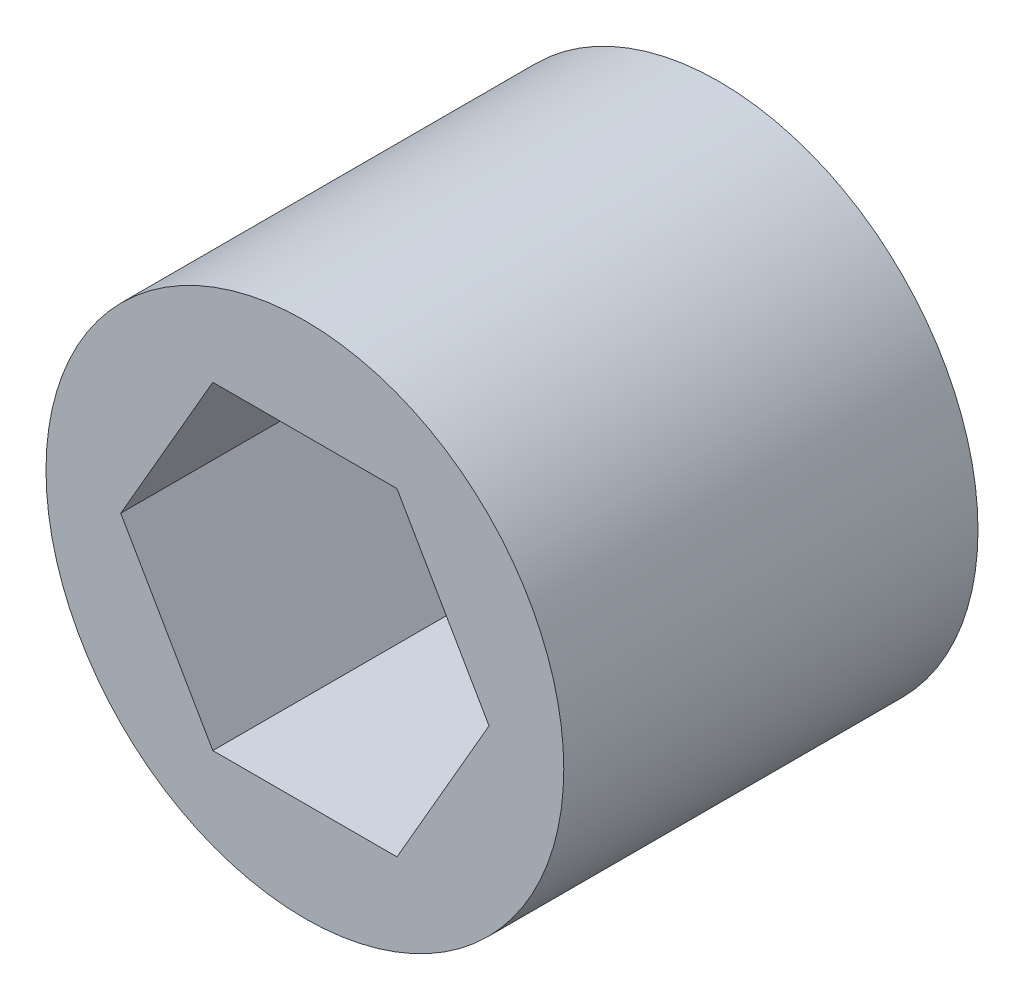
ISO-10303-21;
HEADER;
FILE_DESCRIPTION(('STEP AP214'),'2;1');
FILE_NAME('part.step','',(''),(''),'','','');
FILE_SCHEMA(('AUTOMOTIVE_DESIGN { 1 0 10303 214 1 1 1 1 }'));
ENDSEC;
DATA;
#1=APPLICATION_CONTEXT('core data for automotive mechanical design processes');
#2=APPLICATION_PROTOCOL_DEFINITION('international standard','automotive_design',2000,#1);
#3=PRODUCT_CONTEXT('',#1,'mechanical');
#4=PRODUCT('Part','Part','',(#3));
#5=PRODUCT_RELATED_PRODUCT_CATEGORY('part','',(#4));
#6=PRODUCT_DEFINITION_FORMATION('','',#4);
#7=PRODUCT_DEFINITION_CONTEXT('part definition',#1,'design');
#8=PRODUCT_DEFINITION('design','',#6,#7);
#9=PRODUCT_DEFINITION_SHAPE('','',#8);
#10=(LENGTH_UNIT() NAMED_UNIT(*) SI_UNIT(.MILLI.,.METRE.));
#11=(NAMED_UNIT(*) PLANE_ANGLE_UNIT() SI_UNIT($,.RADIAN.));
#12=(NAMED_UNIT(*) SI_UNIT($,.STERADIAN.) SOLID_ANGLE_UNIT());
#13=UNCERTAINTY_MEASURE_WITH_UNIT(LENGTH_MEASURE(1.E-05),#10,'distance_accuracy_value','');
#14=(GEOMETRIC_REPRESENTATION_CONTEXT(3) GLOBAL_UNCERTAINTY_ASSIGNED_CONTEXT((#13)) GLOBAL_UNIT_ASSIGNED_CONTEXT((#10,
#11,#12)) REPRESENTATION_CONTEXT('',''));
#15=CARTESIAN_POINT('',(0.,0.,0.));
#16=DIRECTION('',(0.,0.,1.));
#17=DIRECTION('',(1.,0.,0.));
#18=AXIS2_PLACEMENT_3D('',#15,#16,#17);
#19=CARTESIAN_POINT('',(0.,0.,6.35));
#20=DIRECTION('',(0.,0.,-1.));
#21=DIRECTION('',(-1.,0.,0.));
#22=AXIS2_PLACEMENT_3D('',#19,#20,#21);
#23=PLANE('',#22);
#24=CARTESIAN_POINT('',(0.,0.,6.35));
#25=DIRECTION('',(0.,0.,1.));
#26=DIRECTION('',(-1.,0.,0.));
#27=AXIS2_PLACEMENT_3D('',#24,#25,#26);
#28=CIRCLE('',#27,7.9375);
#29=CARTESIAN_POINT('',(-7.9375,0.,6.35));
#30=VERTEX_POINT('',#29);
#31=EDGE_CURVE('E11',#30,#30,#28,.T.);
#32=ORIENTED_EDGE('',*,*,#31,.T.);
#33=EDGE_LOOP('',(#32));
#34=FACE_BOUND('',#33,.T.);
#35=DIRECTION('',(-1.,0.,0.));
#36=VECTOR('',#35,1.);
#37=CARTESIAN_POINT('',(2.82295414120268,4.8895,6.35));
#38=LINE('',#37,#36);
#39=CARTESIAN_POINT('',(2.82295414120268,4.8895,6.35));
#40=VERTEX_POINT('',#39);
#41=CARTESIAN_POINT('',(-2.82295414120268,4.8895,6.35));
#42=VERTEX_POINT('',#41);
#43=EDGE_CURVE('E87',#40,#42,#38,.T.);
#44=ORIENTED_EDGE('',*,*,#43,.F.);
#45=DIRECTION('',(-0.5,0.866025403784439,0.));
#46=VECTOR('',#45,1.);
#47=CARTESIAN_POINT('',(5.64590828240535,0.,6.35));
#48=LINE('',#47,#46);
#49=CARTESIAN_POINT('',(5.64590828240535,0.,6.35));
#50=VERTEX_POINT('',#49);
#51=EDGE_CURVE('E115',#50,#40,#48,.T.);
#52=ORIENTED_EDGE('',*,*,#51,.F.);
#53=DIRECTION('',(0.5,0.866025403784439,0.));
#54=VECTOR('',#53,1.);
#55=CARTESIAN_POINT('',(2.82295414120268,-4.8895,6.35));
#56=LINE('',#55,#54);
#57=CARTESIAN_POINT('',(2.82295414120268,-4.8895,6.35));
#58=VERTEX_POINT('',#57);
#59=EDGE_CURVE('E113',#58,#50,#56,.T.);
#60=ORIENTED_EDGE('',*,*,#59,.F.);
#61=DIRECTION('',(1.,0.,0.));
#62=VECTOR('',#61,1.);
#63=CARTESIAN_POINT('',(-2.82295414120267,-4.8895,6.35));
#64=LINE('',#63,#62);
#65=CARTESIAN_POINT('',(-2.82295414120267,-4.8895,6.35));
#66=VERTEX_POINT('',#65);
#67=EDGE_CURVE('E109',#66,#58,#64,.T.);
#68=ORIENTED_EDGE('',*,*,#67,.F.);
#69=DIRECTION('',(0.5,-0.866025403784438,0.));
#70=VECTOR('',#69,1.);
#71=CARTESIAN_POINT('',(-5.64590828240535,0.,6.35));
#72=LINE('',#71,#70);
#73=CARTESIAN_POINT('',(-5.64590828240535,0.,6.35));
#74=VERTEX_POINT('',#73);
#75=EDGE_CURVE('E107',#74,#66,#72,.T.);
#76=ORIENTED_EDGE('',*,*,#75,.F.);
#77=DIRECTION('',(-0.5,-0.866025403784439,0.));
#78=VECTOR('',#77,1.);
#79=CARTESIAN_POINT('',(-2.82295414120268,4.8895,6.35));
#80=LINE('',#79,#78);
#81=EDGE_CURVE('E95',#42,#74,#80,.T.);
#82=ORIENTED_EDGE('',*,*,#81,.F.);
#83=EDGE_LOOP('',(#44,#52,#60,#68,#76,#82));
#84=FACE_BOUND('',#83,.T.);
#85=ADVANCED_FACE('F34',(#34,#84),#23,.F.);
#86=CARTESIAN_POINT('',(0.,0.,-6.35));
#87=DIRECTION('',(0.,0.,-1.));
#88=DIRECTION('',(-1.,0.,0.));
#89=AXIS2_PLACEMENT_3D('',#86,#87,#88);
#90=PLANE('',#89);
#91=CARTESIAN_POINT('',(0.,0.,-6.35));
#92=DIRECTION('',(0.,0.,1.));
#93=DIRECTION('',(-1.,0.,0.));
#94=AXIS2_PLACEMENT_3D('',#91,#92,#93);
#95=CIRCLE('',#94,7.9375);
#96=CARTESIAN_POINT('',(-7.9375,0.,-6.35));
#97=VERTEX_POINT('',#96);
#98=EDGE_CURVE('E38',#97,#97,#95,.T.);
#99=ORIENTED_EDGE('',*,*,#98,.F.);
#100=EDGE_LOOP('',(#99));
#101=FACE_BOUND('',#100,.T.);
#102=DIRECTION('',(-0.5,0.866025403784439,0.));
#103=VECTOR('',#102,1.);
#104=CARTESIAN_POINT('',(5.64590828240535,0.,-6.35));
#105=LINE('',#104,#103);
#106=CARTESIAN_POINT('',(5.64590828240535,0.,-6.35));
#107=VERTEX_POINT('',#106);
#108=CARTESIAN_POINT('',(2.82295414120268,4.8895,-6.35));
#109=VERTEX_POINT('',#108);
#110=EDGE_CURVE('E96',#107,#109,#105,.T.);
#111=ORIENTED_EDGE('',*,*,#110,.T.);
#112=DIRECTION('',(-1.,0.,0.));
#113=VECTOR('',#112,1.);
#114=CARTESIAN_POINT('',(2.82295414120268,4.8895,-6.35));
#115=LINE('',#114,#113);
#116=CARTESIAN_POINT('',(-2.82295414120268,4.8895,-6.35));
#117=VERTEX_POINT('',#116);
#118=EDGE_CURVE('E57',#109,#117,#115,.T.);
#119=ORIENTED_EDGE('',*,*,#118,.T.);
#120=DIRECTION('',(-0.5,-0.866025403784439,0.));
#121=VECTOR('',#120,1.);
#122=CARTESIAN_POINT('',(-2.82295414120268,4.8895,-6.35));
#123=LINE('',#122,#121);
#124=CARTESIAN_POINT('',(-5.64590828240535,0.,-6.35));
#125=VERTEX_POINT('',#124);
#126=EDGE_CURVE('E102',#117,#125,#123,.T.);
#127=ORIENTED_EDGE('',*,*,#126,.T.);
#128=DIRECTION('',(0.5,-0.866025403784438,0.));
#129=VECTOR('',#128,1.);
#130=CARTESIAN_POINT('',(-5.64590828240535,0.,-6.35));
#131=LINE('',#130,#129);
#132=CARTESIAN_POINT('',(-2.82295414120267,-4.8895,-6.35));
#133=VERTEX_POINT('',#132);
#134=EDGE_CURVE('E119',#125,#133,#131,.T.);
#135=ORIENTED_EDGE('',*,*,#134,.T.);
#136=DIRECTION('',(1.,0.,0.));
#137=VECTOR('',#136,1.);
#138=CARTESIAN_POINT('',(-2.82295414120267,-4.8895,-6.35));
#139=LINE('',#138,#137);
#140=CARTESIAN_POINT('',(2.82295414120268,-4.8895,-6.35));
#141=VERTEX_POINT('',#140);
#142=EDGE_CURVE('E122',#133,#141,#139,.T.);
#143=ORIENTED_EDGE('',*,*,#142,.T.);
#144=DIRECTION('',(0.5,0.866025403784439,0.));
#145=VECTOR('',#144,1.);
#146=CARTESIAN_POINT('',(2.82295414120268,-4.8895,-6.35));
#147=LINE('',#146,#145);
#148=EDGE_CURVE('E125',#141,#107,#147,.T.);
#149=ORIENTED_EDGE('',*,*,#148,.T.);
#150=EDGE_LOOP('',(#111,#119,#127,#135,#143,#149));
#151=FACE_BOUND('',#150,.T.);
#152=ADVANCED_FACE('F142',(#101,#151),#90,.T.);
#153=CARTESIAN_POINT('',(0.,0.,6.35));
#154=DIRECTION('',(0.,0.,-1.));
#155=DIRECTION('',(-1.,0.,0.));
#156=AXIS2_PLACEMENT_3D('',#153,#154,#155);
#157=CYLINDRICAL_SURFACE('',#156,7.9375);
#158=ORIENTED_EDGE('',*,*,#31,.F.);
#159=EDGE_LOOP('',(#158));
#160=FACE_BOUND('',#159,.T.);
#161=ORIENTED_EDGE('',*,*,#98,.T.);
#162=EDGE_LOOP('',(#161));
#163=FACE_BOUND('',#162,.T.);
#164=ADVANCED_FACE('F36',(#160,#163),#157,.T.);
#165=CARTESIAN_POINT('',(2.82295414120268,4.8895,6.35));
#166=DIRECTION('',(0.,-1.,0.));
#167=DIRECTION('',(1.,0.,0.));
#168=AXIS2_PLACEMENT_3D('',#165,#166,#167);
#169=PLANE('',#168);
#170=ORIENTED_EDGE('',*,*,#118,.F.);
#171=DIRECTION('',(0.,0.,-1.));
#172=VECTOR('',#171,1.);
#173=CARTESIAN_POINT('',(2.82295414120268,4.8895,6.35));
#174=LINE('',#173,#172);
#175=EDGE_CURVE('E91',#40,#109,#174,.T.);
#176=ORIENTED_EDGE('',*,*,#175,.F.);
#177=ORIENTED_EDGE('',*,*,#43,.T.);
#178=DIRECTION('',(0.,0.,-1.));
#179=VECTOR('',#178,1.);
#180=CARTESIAN_POINT('',(-2.82295414120268,4.8895,6.35));
#181=LINE('',#180,#179);
#182=EDGE_CURVE('E90',#42,#117,#181,.T.);
#183=ORIENTED_EDGE('',*,*,#182,.T.);
#184=EDGE_LOOP('',(#170,#176,#177,#183));
#185=FACE_BOUND('',#184,.T.);
#186=ADVANCED_FACE('F89',(#185),#169,.T.);
#187=CARTESIAN_POINT('',(-2.82295414120268,4.8895,6.35));
#188=DIRECTION('',(0.866025403784439,-0.5,0.));
#189=DIRECTION('',(0.5,0.866025403784439,0.));
#190=AXIS2_PLACEMENT_3D('',#187,#188,#189);
#191=PLANE('',#190);
#192=ORIENTED_EDGE('',*,*,#126,.F.);
#193=ORIENTED_EDGE('',*,*,#182,.F.);
#194=ORIENTED_EDGE('',*,*,#81,.T.);
#195=DIRECTION('',(0.,0.,-1.));
#196=VECTOR('',#195,1.);
#197=CARTESIAN_POINT('',(-5.64590828240535,0.,6.35));
#198=LINE('',#197,#196);
#199=EDGE_CURVE('E103',#74,#125,#198,.T.);
#200=ORIENTED_EDGE('',*,*,#199,.T.);
#201=EDGE_LOOP('',(#192,#193,#194,#200));
#202=FACE_BOUND('',#201,.T.);
#203=ADVANCED_FACE('F99',(#202),#191,.T.);
#204=CARTESIAN_POINT('',(-5.64590828240535,0.,6.35));
#205=DIRECTION('',(0.866025403784438,0.5,0.));
#206=DIRECTION('',(-0.5,0.866025403784439,0.));
#207=AXIS2_PLACEMENT_3D('',#204,#205,#206);
#208=PLANE('',#207);
#209=ORIENTED_EDGE('',*,*,#134,.F.);
#210=ORIENTED_EDGE('',*,*,#199,.F.);
#211=ORIENTED_EDGE('',*,*,#75,.T.);
#212=DIRECTION('',(0.,0.,-1.));
#213=VECTOR('',#212,1.);
#214=CARTESIAN_POINT('',(-2.82295414120267,-4.8895,6.35));
#215=LINE('',#214,#213);
#216=EDGE_CURVE('E134',#66,#133,#215,.T.);
#217=ORIENTED_EDGE('',*,*,#216,.T.);
#218=EDGE_LOOP('',(#209,#210,#211,#217));
#219=FACE_BOUND('',#218,.T.);
#220=ADVANCED_FACE('F138',(#219),#208,.T.);
#221=CARTESIAN_POINT('',(-2.82295414120267,-4.8895,6.35));
#222=DIRECTION('',(0.,1.,0.));
#223=DIRECTION('',(-1.,0.,0.));
#224=AXIS2_PLACEMENT_3D('',#221,#222,#223);
#225=PLANE('',#224);
#226=ORIENTED_EDGE('',*,*,#142,.F.);
#227=ORIENTED_EDGE('',*,*,#216,.F.);
#228=ORIENTED_EDGE('',*,*,#67,.T.);
#229=DIRECTION('',(0.,0.,-1.));
#230=VECTOR('',#229,1.);
#231=CARTESIAN_POINT('',(2.82295414120268,-4.8895,6.35));
#232=LINE('',#231,#230);
#233=EDGE_CURVE('E132',#58,#141,#232,.T.);
#234=ORIENTED_EDGE('',*,*,#233,.T.);
#235=EDGE_LOOP('',(#226,#227,#228,#234));
#236=FACE_BOUND('',#235,.T.);
#237=ADVANCED_FACE('F150',(#236),#225,.T.);
#238=CARTESIAN_POINT('',(2.82295414120268,-4.8895,6.35));
#239=DIRECTION('',(-0.866025403784439,0.5,0.));
#240=DIRECTION('',(-0.5,-0.866025403784439,0.));
#241=AXIS2_PLACEMENT_3D('',#238,#239,#240);
#242=PLANE('',#241);
#243=ORIENTED_EDGE('',*,*,#148,.F.);
#244=ORIENTED_EDGE('',*,*,#233,.F.);
#245=ORIENTED_EDGE('',*,*,#59,.T.);
#246=DIRECTION('',(0.,0.,-1.));
#247=VECTOR('',#246,1.);
#248=CARTESIAN_POINT('',(5.64590828240535,0.,6.35));
#249=LINE('',#248,#247);
#250=EDGE_CURVE('E49',#50,#107,#249,.T.);
#251=ORIENTED_EDGE('',*,*,#250,.T.);
#252=EDGE_LOOP('',(#243,#244,#245,#251));
#253=FACE_BOUND('',#252,.T.);
#254=ADVANCED_FACE('F148',(#253),#242,.T.);
#255=CARTESIAN_POINT('',(5.64590828240535,0.,6.35));
#256=DIRECTION('',(-0.866025403784439,-0.5,0.));
#257=DIRECTION('',(0.5,-0.866025403784439,0.));
#258=AXIS2_PLACEMENT_3D('',#255,#256,#257);
#259=PLANE('',#258);
#260=ORIENTED_EDGE('',*,*,#110,.F.);
#261=ORIENTED_EDGE('',*,*,#250,.F.);
#262=ORIENTED_EDGE('',*,*,#51,.T.);
#263=ORIENTED_EDGE('',*,*,#175,.T.);
#264=EDGE_LOOP('',(#260,#261,#262,#263));
#265=FACE_BOUND('',#264,.T.);
#266=ADVANCED_FACE('F144',(#265),#259,.T.);
#267=CLOSED_SHELL('',(#85,#152,#164,#186,#203,#220,#237,#254,#266));
#268=MANIFOLD_SOLID_BREP('B2',#267);
#269=ADVANCED_BREP_SHAPE_REPRESENTATION('',(#18,#268),#14);
#270=SHAPE_DEFINITION_REPRESENTATION(#9,#269);
ENDSEC;
END-ISO-10303-21;
